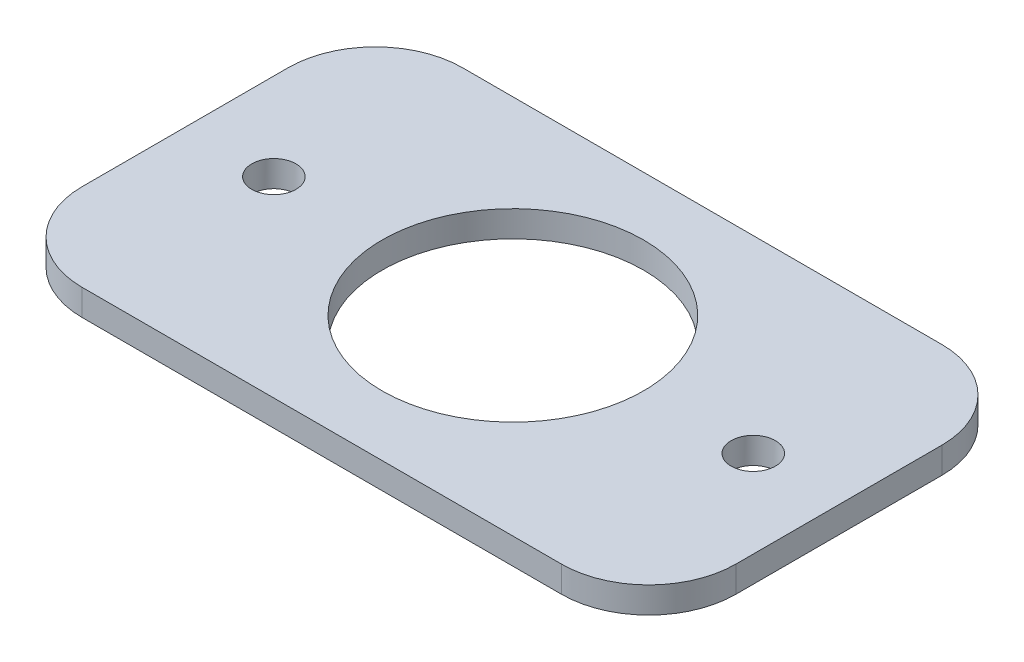
ISO-10303-21;
HEADER;
FILE_DESCRIPTION(('STEP AP214'),'2;1');
FILE_NAME('part.step','',(''),(''),'','','');
FILE_SCHEMA(('AUTOMOTIVE_DESIGN { 1 0 10303 214 1 1 1 1 }'));
ENDSEC;
DATA;
#1=APPLICATION_CONTEXT('core data for automotive mechanical design processes');
#2=APPLICATION_PROTOCOL_DEFINITION('international standard','automotive_design',2000,#1);
#3=PRODUCT_CONTEXT('',#1,'mechanical');
#4=PRODUCT('Part','Part','',(#3));
#5=PRODUCT_RELATED_PRODUCT_CATEGORY('part','',(#4));
#6=PRODUCT_DEFINITION_FORMATION('','',#4);
#7=PRODUCT_DEFINITION_CONTEXT('part definition',#1,'design');
#8=PRODUCT_DEFINITION('design','',#6,#7);
#9=PRODUCT_DEFINITION_SHAPE('','',#8);
#10=(LENGTH_UNIT() NAMED_UNIT(*) SI_UNIT(.MILLI.,.METRE.));
#11=(NAMED_UNIT(*) PLANE_ANGLE_UNIT() SI_UNIT($,.RADIAN.));
#12=(NAMED_UNIT(*) SI_UNIT($,.STERADIAN.) SOLID_ANGLE_UNIT());
#13=UNCERTAINTY_MEASURE_WITH_UNIT(LENGTH_MEASURE(1.E-05),#10,'distance_accuracy_value','');
#14=(GEOMETRIC_REPRESENTATION_CONTEXT(3) GLOBAL_UNCERTAINTY_ASSIGNED_CONTEXT((#13)) GLOBAL_UNIT_ASSIGNED_CONTEXT((#10,
#11,#12)) REPRESENTATION_CONTEXT('',''));
#15=CARTESIAN_POINT('',(0.,0.,0.));
#16=DIRECTION('',(0.,0.,1.));
#17=DIRECTION('',(1.,0.,0.));
#18=AXIS2_PLACEMENT_3D('',#15,#16,#17);
#19=CARTESIAN_POINT('',(65.082223351372,-3.,-33.7204406053352));
#20=DIRECTION('',(1.,0.,0.));
#21=DIRECTION('',(0.,0.,-1.));
#22=AXIS2_PLACEMENT_3D('',#19,#20,#21);
#23=PLANE('',#22);
#24=DIRECTION('',(0.,0.,-1.));
#25=VECTOR('',#24,1.);
#26=CARTESIAN_POINT('',(65.082223351372,-3.,-33.7204406053352));
#27=LINE('',#26,#25);
#28=CARTESIAN_POINT('',(65.082223351372,-3.,-0.0822233513720141));
#29=VERTEX_POINT('',#28);
#30=CARTESIAN_POINT('',(65.082223351372,-3.,-23.7204406053352));
#31=VERTEX_POINT('',#30);
#32=EDGE_CURVE('E169',#29,#31,#27,.T.);
#33=ORIENTED_EDGE('',*,*,#32,.T.);
#34=DIRECTION('',(0.,1.,0.));
#35=VECTOR('',#34,1.);
#36=CARTESIAN_POINT('',(65.082223351372,-3.,-23.7204406053352));
#37=LINE('',#36,#35);
#38=CARTESIAN_POINT('',(65.082223351372,0.,-23.7204406053352));
#39=VERTEX_POINT('',#38);
#40=EDGE_CURVE('E124',#31,#39,#37,.T.);
#41=ORIENTED_EDGE('',*,*,#40,.T.);
#42=DIRECTION('',(0.,0.,-1.));
#43=VECTOR('',#42,1.);
#44=CARTESIAN_POINT('',(65.082223351372,0.,-33.7204406053352));
#45=LINE('',#44,#43);
#46=CARTESIAN_POINT('',(65.082223351372,0.,-0.0822233513720141));
#47=VERTEX_POINT('',#46);
#48=EDGE_CURVE('E109',#47,#39,#45,.T.);
#49=ORIENTED_EDGE('',*,*,#48,.F.);
#50=DIRECTION('',(0.,1.,0.));
#51=VECTOR('',#50,1.);
#52=CARTESIAN_POINT('',(65.082223351372,-3.,-0.0822233513720003));
#53=LINE('',#52,#51);
#54=EDGE_CURVE('E121',#47,#29,#53,.F.);
#55=ORIENTED_EDGE('',*,*,#54,.T.);
#56=EDGE_LOOP('',(#33,#41,#49,#55));
#57=FACE_BOUND('',#56,.T.);
#58=ADVANCED_FACE('F39',(#57),#23,.T.);
#59=CARTESIAN_POINT('',(65.082223351372,-3.,9.917776648628));
#60=DIRECTION('',(0.,0.,1.));
#61=DIRECTION('',(1.,0.,0.));
#62=AXIS2_PLACEMENT_3D('',#59,#60,#61);
#63=PLANE('',#62);
#64=DIRECTION('',(1.,0.,0.));
#65=VECTOR('',#64,1.);
#66=CARTESIAN_POINT('',(65.082223351372,-3.,9.917776648628));
#67=LINE('',#66,#65);
#68=CARTESIAN_POINT('',(0.0822233513719933,-3.,9.917776648628));
#69=VERTEX_POINT('',#68);
#70=CARTESIAN_POINT('',(55.082223351372,-3.,9.917776648628));
#71=VERTEX_POINT('',#70);
#72=EDGE_CURVE('E131',#69,#71,#67,.T.);
#73=ORIENTED_EDGE('',*,*,#72,.T.);
#74=DIRECTION('',(0.,1.,0.));
#75=VECTOR('',#74,1.);
#76=CARTESIAN_POINT('',(55.082223351372,-3.,9.917776648628));
#77=LINE('',#76,#75);
#78=CARTESIAN_POINT('',(55.082223351372,0.,9.917776648628));
#79=VERTEX_POINT('',#78);
#80=EDGE_CURVE('E11',#71,#79,#77,.T.);
#81=ORIENTED_EDGE('',*,*,#80,.T.);
#82=DIRECTION('',(1.,0.,0.));
#83=VECTOR('',#82,1.);
#84=CARTESIAN_POINT('',(65.082223351372,0.,9.917776648628));
#85=LINE('',#84,#83);
#86=CARTESIAN_POINT('',(0.0822233513719933,0.,9.917776648628));
#87=VERTEX_POINT('',#86);
#88=EDGE_CURVE('E111',#87,#79,#85,.T.);
#89=ORIENTED_EDGE('',*,*,#88,.F.);
#90=DIRECTION('',(0.,1.,0.));
#91=VECTOR('',#90,1.);
#92=CARTESIAN_POINT('',(0.0822233513719933,-3.,9.917776648628));
#93=LINE('',#92,#91);
#94=EDGE_CURVE('E47',#87,#69,#93,.F.);
#95=ORIENTED_EDGE('',*,*,#94,.T.);
#96=EDGE_LOOP('',(#73,#81,#89,#95));
#97=FACE_BOUND('',#96,.T.);
#98=ADVANCED_FACE('F160',(#97),#63,.T.);
#99=CARTESIAN_POINT('',(-9.91777664862802,-3.,-33.7204406053352));
#100=DIRECTION('',(-1.,0.,0.));
#101=DIRECTION('',(0.,0.,1.));
#102=AXIS2_PLACEMENT_3D('',#99,#100,#101);
#103=PLANE('',#102);
#104=DIRECTION('',(0.,0.,1.));
#105=VECTOR('',#104,1.);
#106=CARTESIAN_POINT('',(-9.91777664862802,0.,-33.7204406053352));
#107=LINE('',#106,#105);
#108=CARTESIAN_POINT('',(-9.91777664862801,0.,-23.7204406053352));
#109=VERTEX_POINT('',#108);
#110=CARTESIAN_POINT('',(-9.91777664862801,0.,-0.0822233513720003));
#111=VERTEX_POINT('',#110);
#112=EDGE_CURVE('E167',#109,#111,#107,.T.);
#113=ORIENTED_EDGE('',*,*,#112,.F.);
#114=DIRECTION('',(0.,1.,0.));
#115=VECTOR('',#114,1.);
#116=CARTESIAN_POINT('',(-9.91777664862801,-3.,-23.7204406053352));
#117=LINE('',#116,#115);
#118=CARTESIAN_POINT('',(-9.91777664862801,-3.,-23.7204406053352));
#119=VERTEX_POINT('',#118);
#120=EDGE_CURVE('E61',#109,#119,#117,.F.);
#121=ORIENTED_EDGE('',*,*,#120,.T.);
#122=DIRECTION('',(0.,0.,1.));
#123=VECTOR('',#122,1.);
#124=CARTESIAN_POINT('',(-9.91777664862802,-3.,-33.7204406053352));
#125=LINE('',#124,#123);
#126=CARTESIAN_POINT('',(-9.91777664862801,-3.,-0.0822233513720003));
#127=VERTEX_POINT('',#126);
#128=EDGE_CURVE('E135',#119,#127,#125,.T.);
#129=ORIENTED_EDGE('',*,*,#128,.T.);
#130=DIRECTION('',(0.,1.,0.));
#131=VECTOR('',#130,1.);
#132=CARTESIAN_POINT('',(-9.91777664862801,-3.,-0.0822233513720003));
#133=LINE('',#132,#131);
#134=EDGE_CURVE('E155',#127,#111,#133,.T.);
#135=ORIENTED_EDGE('',*,*,#134,.T.);
#136=EDGE_LOOP('',(#113,#121,#129,#135));
#137=FACE_BOUND('',#136,.T.);
#138=ADVANCED_FACE('F166',(#137),#103,.T.);
#139=CARTESIAN_POINT('',(65.082223351372,-3.,-33.7204406053352));
#140=DIRECTION('',(0.,0.,-1.));
#141=DIRECTION('',(-1.,0.,0.));
#142=AXIS2_PLACEMENT_3D('',#139,#140,#141);
#143=PLANE('',#142);
#144=DIRECTION('',(-1.,0.,0.));
#145=VECTOR('',#144,1.);
#146=CARTESIAN_POINT('',(65.082223351372,0.,-33.7204406053352));
#147=LINE('',#146,#145);
#148=CARTESIAN_POINT('',(55.082223351372,0.,-33.7204406053352));
#149=VERTEX_POINT('',#148);
#150=CARTESIAN_POINT('',(0.0822233513719794,0.,-33.7204406053352));
#151=VERTEX_POINT('',#150);
#152=EDGE_CURVE('E125',#149,#151,#147,.T.);
#153=ORIENTED_EDGE('',*,*,#152,.F.);
#154=DIRECTION('',(0.,1.,0.));
#155=VECTOR('',#154,1.);
#156=CARTESIAN_POINT('',(55.082223351372,-3.,-33.7204406053352));
#157=LINE('',#156,#155);
#158=CARTESIAN_POINT('',(55.082223351372,-3.,-33.7204406053352));
#159=VERTEX_POINT('',#158);
#160=EDGE_CURVE('E147',#149,#159,#157,.F.);
#161=ORIENTED_EDGE('',*,*,#160,.T.);
#162=DIRECTION('',(-1.,0.,0.));
#163=VECTOR('',#162,1.);
#164=CARTESIAN_POINT('',(65.082223351372,-3.,-33.7204406053352));
#165=LINE('',#164,#163);
#166=CARTESIAN_POINT('',(0.0822233513719794,-3.,-33.7204406053352));
#167=VERTEX_POINT('',#166);
#168=EDGE_CURVE('E173',#159,#167,#165,.T.);
#169=ORIENTED_EDGE('',*,*,#168,.T.);
#170=DIRECTION('',(0.,1.,0.));
#171=VECTOR('',#170,1.);
#172=CARTESIAN_POINT('',(0.0822233513719794,-3.,-33.7204406053352));
#173=LINE('',#172,#171);
#174=EDGE_CURVE('E144',#167,#151,#173,.T.);
#175=ORIENTED_EDGE('',*,*,#174,.T.);
#176=EDGE_LOOP('',(#153,#161,#169,#175));
#177=FACE_BOUND('',#176,.T.);
#178=ADVANCED_FACE('F212',(#177),#143,.T.);
#179=CARTESIAN_POINT('',(0.,-3.,0.));
#180=DIRECTION('',(0.,-1.,0.));
#181=DIRECTION('',(0.,0.,-1.));
#182=AXIS2_PLACEMENT_3D('',#179,#180,#181);
#183=PLANE('',#182);
#184=CARTESIAN_POINT('',(0.0822233513719864,-3.,-12.082223351372));
#185=DIRECTION('',(0.,-1.,0.));
#186=DIRECTION('',(0.,0.,-1.));
#187=AXIS2_PLACEMENT_3D('',#184,#185,#186);
#188=CIRCLE('',#187,2.54);
#189=CARTESIAN_POINT('',(0.0822233513719864,-3.,-14.622223351372));
#190=VERTEX_POINT('',#189);
#191=EDGE_CURVE('E180',#190,#190,#188,.T.);
#192=ORIENTED_EDGE('',*,*,#191,.F.);
#193=EDGE_LOOP('',(#192));
#194=FACE_BOUND('',#193,.T.);
#195=CARTESIAN_POINT('',(55.082223351372,-3.,-12.082223351372));
#196=DIRECTION('',(0.,-1.,0.));
#197=DIRECTION('',(0.,0.,-1.));
#198=AXIS2_PLACEMENT_3D('',#195,#196,#197);
#199=CIRCLE('',#198,2.54);
#200=CARTESIAN_POINT('',(55.082223351372,-3.,-14.622223351372));
#201=VERTEX_POINT('',#200);
#202=EDGE_CURVE('E185',#201,#201,#199,.T.);
#203=ORIENTED_EDGE('',*,*,#202,.F.);
#204=EDGE_LOOP('',(#203));
#205=FACE_BOUND('',#204,.T.);
#206=CARTESIAN_POINT('',(27.582223351372,-3.,-12.));
#207=DIRECTION('',(0.,-1.,0.));
#208=DIRECTION('',(0.,0.,-1.));
#209=AXIS2_PLACEMENT_3D('',#206,#207,#208);
#210=CIRCLE('',#209,15.);
#211=CARTESIAN_POINT('',(27.582223351372,-3.,-27.));
#212=VERTEX_POINT('',#211);
#213=EDGE_CURVE('E177',#212,#212,#210,.T.);
#214=ORIENTED_EDGE('',*,*,#213,.F.);
#215=EDGE_LOOP('',(#214));
#216=FACE_BOUND('',#215,.T.);
#217=ORIENTED_EDGE('',*,*,#168,.F.);
#218=CARTESIAN_POINT('',(55.082223351372,-3.,-23.7204406053352));
#219=DIRECTION('',(0.,-1.,0.));
#220=DIRECTION('',(0.,0.,-1.));
#221=AXIS2_PLACEMENT_3D('',#218,#219,#220);
#222=CIRCLE('',#221,10.);
#223=EDGE_CURVE('E153',#159,#31,#222,.T.);
#224=ORIENTED_EDGE('',*,*,#223,.T.);
#225=ORIENTED_EDGE('',*,*,#32,.F.);
#226=CARTESIAN_POINT('',(55.082223351372,-3.,-0.0822233513720023));
#227=DIRECTION('',(0.,-1.,0.));
#228=DIRECTION('',(0.,0.,-1.));
#229=AXIS2_PLACEMENT_3D('',#226,#227,#228);
#230=CIRCLE('',#229,10.);
#231=EDGE_CURVE('E130',#29,#71,#230,.T.);
#232=ORIENTED_EDGE('',*,*,#231,.T.);
#233=ORIENTED_EDGE('',*,*,#72,.F.);
#234=CARTESIAN_POINT('',(0.0822233513719913,-3.,-0.0822233513720003));
#235=DIRECTION('',(0.,-1.,0.));
#236=DIRECTION('',(0.,0.,-1.));
#237=AXIS2_PLACEMENT_3D('',#234,#235,#236);
#238=CIRCLE('',#237,10.);
#239=EDGE_CURVE('E54',#69,#127,#238,.T.);
#240=ORIENTED_EDGE('',*,*,#239,.T.);
#241=ORIENTED_EDGE('',*,*,#128,.F.);
#242=CARTESIAN_POINT('',(0.0822233513719794,-3.,-23.7204406053352));
#243=DIRECTION('',(0.,-1.,0.));
#244=DIRECTION('',(0.,0.,-1.));
#245=AXIS2_PLACEMENT_3D('',#242,#243,#244);
#246=CIRCLE('',#245,10.);
#247=EDGE_CURVE('E151',#119,#167,#246,.T.);
#248=ORIENTED_EDGE('',*,*,#247,.T.);
#249=EDGE_LOOP('',(#217,#224,#225,#232,#233,#240,#241,#248));
#250=FACE_BOUND('',#249,.T.);
#251=ADVANCED_FACE('F163',(#194,#205,#216,#250),#183,.T.);
#252=CARTESIAN_POINT('',(0.,0.,0.));
#253=DIRECTION('',(0.,-1.,0.));
#254=DIRECTION('',(0.,0.,-1.));
#255=AXIS2_PLACEMENT_3D('',#252,#253,#254);
#256=PLANE('',#255);
#257=CARTESIAN_POINT('',(0.0822233513719864,0.,-12.082223351372));
#258=DIRECTION('',(0.,1.,0.));
#259=DIRECTION('',(0.,0.,1.));
#260=AXIS2_PLACEMENT_3D('',#257,#258,#259);
#261=CIRCLE('',#260,2.54);
#262=CARTESIAN_POINT('',(0.0822233513719864,0.,-9.54222335137199));
#263=VERTEX_POINT('',#262);
#264=EDGE_CURVE('E188',#263,#263,#261,.T.);
#265=ORIENTED_EDGE('',*,*,#264,.F.);
#266=EDGE_LOOP('',(#265));
#267=FACE_BOUND('',#266,.T.);
#268=CARTESIAN_POINT('',(55.082223351372,0.,-12.082223351372));
#269=DIRECTION('',(0.,1.,0.));
#270=DIRECTION('',(0.,0.,1.));
#271=AXIS2_PLACEMENT_3D('',#268,#269,#270);
#272=CIRCLE('',#271,2.54);
#273=CARTESIAN_POINT('',(55.082223351372,0.,-9.54222335137199));
#274=VERTEX_POINT('',#273);
#275=EDGE_CURVE('E189',#274,#274,#272,.T.);
#276=ORIENTED_EDGE('',*,*,#275,.F.);
#277=EDGE_LOOP('',(#276));
#278=FACE_BOUND('',#277,.T.);
#279=CARTESIAN_POINT('',(27.582223351372,0.,-12.));
#280=DIRECTION('',(0.,-1.,0.));
#281=DIRECTION('',(0.,0.,-1.));
#282=AXIS2_PLACEMENT_3D('',#279,#280,#281);
#283=CIRCLE('',#282,15.);
#284=CARTESIAN_POINT('',(27.582223351372,0.,-27.));
#285=VERTEX_POINT('',#284);
#286=EDGE_CURVE('E126',#285,#285,#283,.T.);
#287=ORIENTED_EDGE('',*,*,#286,.T.);
#288=EDGE_LOOP('',(#287));
#289=FACE_BOUND('',#288,.T.);
#290=ORIENTED_EDGE('',*,*,#48,.T.);
#291=CARTESIAN_POINT('',(55.082223351372,0.,-23.7204406053352));
#292=DIRECTION('',(0.,-1.,0.));
#293=DIRECTION('',(0.,0.,-1.));
#294=AXIS2_PLACEMENT_3D('',#291,#292,#293);
#295=CIRCLE('',#294,10.);
#296=EDGE_CURVE('E142',#39,#149,#295,.F.);
#297=ORIENTED_EDGE('',*,*,#296,.T.);
#298=ORIENTED_EDGE('',*,*,#152,.T.);
#299=CARTESIAN_POINT('',(0.0822233513719794,0.,-23.7204406053352));
#300=DIRECTION('',(0.,-1.,0.));
#301=DIRECTION('',(0.,0.,-1.));
#302=AXIS2_PLACEMENT_3D('',#299,#300,#301);
#303=CIRCLE('',#302,10.);
#304=EDGE_CURVE('E115',#151,#109,#303,.F.);
#305=ORIENTED_EDGE('',*,*,#304,.T.);
#306=ORIENTED_EDGE('',*,*,#112,.T.);
#307=CARTESIAN_POINT('',(0.0822233513719913,0.,-0.0822233513720003));
#308=DIRECTION('',(0.,-1.,0.));
#309=DIRECTION('',(0.,0.,-1.));
#310=AXIS2_PLACEMENT_3D('',#307,#308,#309);
#311=CIRCLE('',#310,10.);
#312=EDGE_CURVE('E116',#111,#87,#311,.F.);
#313=ORIENTED_EDGE('',*,*,#312,.T.);
#314=ORIENTED_EDGE('',*,*,#88,.T.);
#315=CARTESIAN_POINT('',(55.082223351372,0.,-0.0822233513720023));
#316=DIRECTION('',(0.,-1.,0.));
#317=DIRECTION('',(0.,0.,-1.));
#318=AXIS2_PLACEMENT_3D('',#315,#316,#317);
#319=CIRCLE('',#318,10.);
#320=EDGE_CURVE('E106',#79,#47,#319,.F.);
#321=ORIENTED_EDGE('',*,*,#320,.T.);
#322=EDGE_LOOP('',(#290,#297,#298,#305,#306,#313,#314,#321));
#323=FACE_BOUND('',#322,.T.);
#324=ADVANCED_FACE('F108',(#267,#278,#289,#323),#256,.F.);
#325=CARTESIAN_POINT('',(27.582223351372,0.,-12.));
#326=DIRECTION('',(0.,-1.,0.));
#327=DIRECTION('',(0.,0.,-1.));
#328=AXIS2_PLACEMENT_3D('',#325,#326,#327);
#329=CYLINDRICAL_SURFACE('',#328,15.);
#330=ORIENTED_EDGE('',*,*,#286,.F.);
#331=EDGE_LOOP('',(#330));
#332=FACE_BOUND('',#331,.T.);
#333=ORIENTED_EDGE('',*,*,#213,.T.);
#334=EDGE_LOOP('',(#333));
#335=FACE_BOUND('',#334,.T.);
#336=ADVANCED_FACE('F199',(#332,#335),#329,.F.);
#337=CARTESIAN_POINT('',(55.082223351372,-3.,-23.7204406053352));
#338=DIRECTION('',(0.,1.,0.));
#339=DIRECTION('',(0.,0.,1.));
#340=AXIS2_PLACEMENT_3D('',#337,#338,#339);
#341=CYLINDRICAL_SURFACE('',#340,10.);
#342=ORIENTED_EDGE('',*,*,#223,.F.);
#343=ORIENTED_EDGE('',*,*,#160,.F.);
#344=ORIENTED_EDGE('',*,*,#296,.F.);
#345=ORIENTED_EDGE('',*,*,#40,.F.);
#346=EDGE_LOOP('',(#342,#343,#344,#345));
#347=FACE_BOUND('',#346,.T.);
#348=ADVANCED_FACE('F207',(#347),#341,.T.);
#349=CARTESIAN_POINT('',(0.0822233513719794,-3.,-23.7204406053352));
#350=DIRECTION('',(0.,1.,0.));
#351=DIRECTION('',(0.,0.,1.));
#352=AXIS2_PLACEMENT_3D('',#349,#350,#351);
#353=CYLINDRICAL_SURFACE('',#352,10.);
#354=ORIENTED_EDGE('',*,*,#247,.F.);
#355=ORIENTED_EDGE('',*,*,#120,.F.);
#356=ORIENTED_EDGE('',*,*,#304,.F.);
#357=ORIENTED_EDGE('',*,*,#174,.F.);
#358=EDGE_LOOP('',(#354,#355,#356,#357));
#359=FACE_BOUND('',#358,.T.);
#360=ADVANCED_FACE('F232',(#359),#353,.T.);
#361=CARTESIAN_POINT('',(55.082223351372,-3.,-0.0822233513720023));
#362=DIRECTION('',(0.,1.,0.));
#363=DIRECTION('',(0.,0.,1.));
#364=AXIS2_PLACEMENT_3D('',#361,#362,#363);
#365=CYLINDRICAL_SURFACE('',#364,10.);
#366=ORIENTED_EDGE('',*,*,#231,.F.);
#367=ORIENTED_EDGE('',*,*,#54,.F.);
#368=ORIENTED_EDGE('',*,*,#320,.F.);
#369=ORIENTED_EDGE('',*,*,#80,.F.);
#370=EDGE_LOOP('',(#366,#367,#368,#369));
#371=FACE_BOUND('',#370,.T.);
#372=ADVANCED_FACE('F129',(#371),#365,.T.);
#373=CARTESIAN_POINT('',(0.0822233513719913,-3.,-0.0822233513720003));
#374=DIRECTION('',(0.,1.,0.));
#375=DIRECTION('',(0.,0.,1.));
#376=AXIS2_PLACEMENT_3D('',#373,#374,#375);
#377=CYLINDRICAL_SURFACE('',#376,10.);
#378=ORIENTED_EDGE('',*,*,#239,.F.);
#379=ORIENTED_EDGE('',*,*,#94,.F.);
#380=ORIENTED_EDGE('',*,*,#312,.F.);
#381=ORIENTED_EDGE('',*,*,#134,.F.);
#382=EDGE_LOOP('',(#378,#379,#380,#381));
#383=FACE_BOUND('',#382,.T.);
#384=ADVANCED_FACE('F41',(#383),#377,.T.);
#385=CARTESIAN_POINT('',(55.082223351372,-10.,-12.082223351372));
#386=DIRECTION('',(0.,1.,0.));
#387=DIRECTION('',(0.,0.,1.));
#388=AXIS2_PLACEMENT_3D('',#385,#386,#387);
#389=CYLINDRICAL_SURFACE('',#388,2.54);
#390=ORIENTED_EDGE('',*,*,#202,.T.);
#391=EDGE_LOOP('',(#390));
#392=FACE_BOUND('',#391,.T.);
#393=ORIENTED_EDGE('',*,*,#275,.T.);
#394=EDGE_LOOP('',(#393));
#395=FACE_BOUND('',#394,.T.);
#396=ADVANCED_FACE('F240',(#392,#395),#389,.F.);
#397=CARTESIAN_POINT('',(0.0822233513719864,-10.,-12.082223351372));
#398=DIRECTION('',(0.,1.,0.));
#399=DIRECTION('',(0.,0.,1.));
#400=AXIS2_PLACEMENT_3D('',#397,#398,#399);
#401=CYLINDRICAL_SURFACE('',#400,2.54);
#402=ORIENTED_EDGE('',*,*,#191,.T.);
#403=EDGE_LOOP('',(#402));
#404=FACE_BOUND('',#403,.T.);
#405=ORIENTED_EDGE('',*,*,#264,.T.);
#406=EDGE_LOOP('',(#405));
#407=FACE_BOUND('',#406,.T.);
#408=ADVANCED_FACE('F195',(#404,#407),#401,.F.);
#409=CLOSED_SHELL('',(#58,#98,#138,#178,#251,#324,#336,#348,#360,#372,#384,#396,#408));
#410=MANIFOLD_SOLID_BREP('B2',#409);
#411=ADVANCED_BREP_SHAPE_REPRESENTATION('',(#18,#410),#14);
#412=SHAPE_DEFINITION_REPRESENTATION(#9,#411);
ENDSEC;
END-ISO-10303-21;
